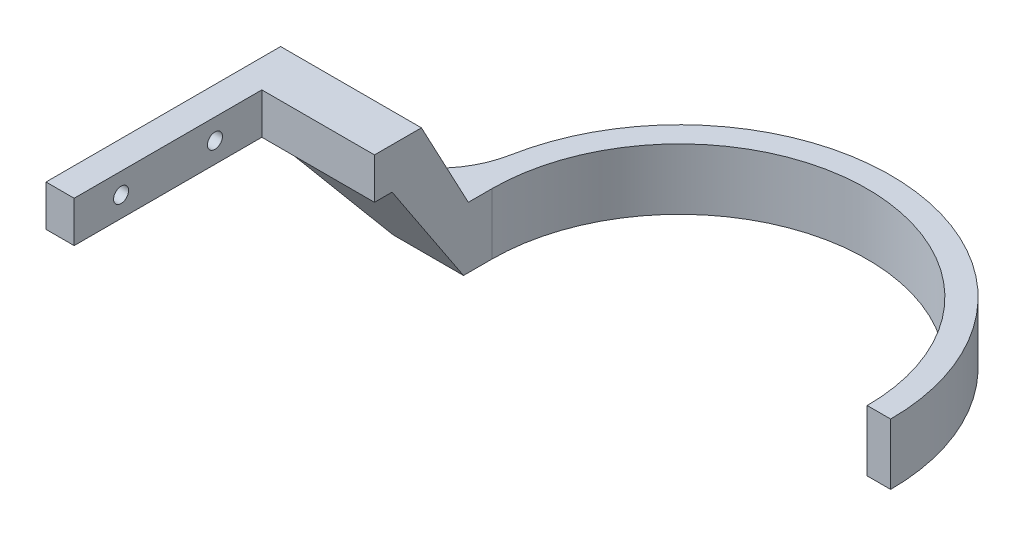
ISO-10303-21;
HEADER;
FILE_DESCRIPTION(('STEP AP214'),'2;1');
FILE_NAME('part.step','',(''),(''),'','','');
FILE_SCHEMA(('AUTOMOTIVE_DESIGN { 1 0 10303 214 1 1 1 1 }'));
ENDSEC;
DATA;
#1=APPLICATION_CONTEXT('core data for automotive mechanical design processes');
#2=APPLICATION_PROTOCOL_DEFINITION('international standard','automotive_design',2000,#1);
#3=PRODUCT_CONTEXT('',#1,'mechanical');
#4=PRODUCT('Part','Part','',(#3));
#5=PRODUCT_RELATED_PRODUCT_CATEGORY('part','',(#4));
#6=PRODUCT_DEFINITION_FORMATION('','',#4);
#7=PRODUCT_DEFINITION_CONTEXT('part definition',#1,'design');
#8=PRODUCT_DEFINITION('design','',#6,#7);
#9=PRODUCT_DEFINITION_SHAPE('','',#8);
#10=(LENGTH_UNIT() NAMED_UNIT(*) SI_UNIT(.MILLI.,.METRE.));
#11=(NAMED_UNIT(*) PLANE_ANGLE_UNIT() SI_UNIT($,.RADIAN.));
#12=(NAMED_UNIT(*) SI_UNIT($,.STERADIAN.) SOLID_ANGLE_UNIT());
#13=UNCERTAINTY_MEASURE_WITH_UNIT(LENGTH_MEASURE(1.E-05),#10,'distance_accuracy_value','');
#14=(GEOMETRIC_REPRESENTATION_CONTEXT(3) GLOBAL_UNCERTAINTY_ASSIGNED_CONTEXT((#13)) GLOBAL_UNIT_ASSIGNED_CONTEXT((#10,
#11,#12)) REPRESENTATION_CONTEXT('',''));
#15=CARTESIAN_POINT('',(0.,0.,0.));
#16=DIRECTION('',(0.,0.,1.));
#17=DIRECTION('',(1.,0.,0.));
#18=AXIS2_PLACEMENT_3D('',#15,#16,#17);
#19=CARTESIAN_POINT('',(0.,0.,25.));
#20=DIRECTION('',(0.,0.,1.));
#21=DIRECTION('',(1.,0.,0.));
#22=AXIS2_PLACEMENT_3D('',#19,#20,#21);
#23=PLANE('',#22);
#24=DIRECTION('',(-1.,0.,0.));
#25=VECTOR('',#24,1.);
#26=CARTESIAN_POINT('',(-40.,31.75,25.));
#27=LINE('',#26,#25);
#28=CARTESIAN_POINT('',(-40.,31.75,25.));
#29=VERTEX_POINT('',#28);
#30=CARTESIAN_POINT('',(-64.,31.75,25.));
#31=VERTEX_POINT('',#30);
#32=EDGE_CURVE('E173',#29,#31,#27,.T.);
#33=ORIENTED_EDGE('',*,*,#32,.T.);
#34=DIRECTION('',(0.,-1.,0.));
#35=VECTOR('',#34,1.);
#36=CARTESIAN_POINT('',(-64.,31.75,25.));
#37=LINE('',#36,#35);
#38=CARTESIAN_POINT('',(-64.,23.,25.));
#39=VERTEX_POINT('',#38);
#40=EDGE_CURVE('E159',#31,#39,#37,.T.);
#41=ORIENTED_EDGE('',*,*,#40,.T.);
#42=DIRECTION('',(1.,0.,0.));
#43=VECTOR('',#42,1.);
#44=CARTESIAN_POINT('',(-70.,23.,25.));
#45=LINE('',#44,#43);
#46=CARTESIAN_POINT('',(-40.,23.,25.));
#47=VERTEX_POINT('',#46);
#48=EDGE_CURVE('E158',#39,#47,#45,.T.);
#49=ORIENTED_EDGE('',*,*,#48,.T.);
#50=DIRECTION('',(0.,1.,0.));
#51=VECTOR('',#50,1.);
#52=CARTESIAN_POINT('',(-40.,23.,25.));
#53=LINE('',#52,#51);
#54=EDGE_CURVE('E177',#47,#29,#53,.T.);
#55=ORIENTED_EDGE('',*,*,#54,.T.);
#56=EDGE_LOOP('',(#33,#41,#49,#55));
#57=FACE_BOUND('',#56,.T.);
#58=ADVANCED_FACE('F35',(#57),#23,.T.);
#59=CARTESIAN_POINT('',(0.,13.,0.));
#60=DIRECTION('',(0.,-1.,0.));
#61=DIRECTION('',(0.,0.,-1.));
#62=AXIS2_PLACEMENT_3D('',#59,#60,#61);
#63=CYLINDRICAL_SURFACE('',#62,40.);
#64=CARTESIAN_POINT('',(0.,0.,0.));
#65=DIRECTION('',(0.,-1.,0.));
#66=DIRECTION('',(0.,0.,-1.));
#67=AXIS2_PLACEMENT_3D('',#64,#65,#66);
#68=CIRCLE('',#67,40.);
#69=CARTESIAN_POINT('',(-40.,0.,0.));
#70=VERTEX_POINT('',#69);
#71=CARTESIAN_POINT('',(40.,0.,0.));
#72=VERTEX_POINT('',#71);
#73=EDGE_CURVE('E202',#70,#72,#68,.T.);
#74=ORIENTED_EDGE('',*,*,#73,.T.);
#75=DIRECTION('',(0.,-1.,0.));
#76=VECTOR('',#75,1.);
#77=CARTESIAN_POINT('',(40.,13.,0.));
#78=LINE('',#77,#76);
#79=CARTESIAN_POINT('',(40.,13.,0.));
#80=VERTEX_POINT('',#79);
#81=EDGE_CURVE('E222',#80,#72,#78,.T.);
#82=ORIENTED_EDGE('',*,*,#81,.F.);
#83=CARTESIAN_POINT('',(0.,13.,0.));
#84=DIRECTION('',(0.,-1.,0.));
#85=DIRECTION('',(0.,0.,-1.));
#86=AXIS2_PLACEMENT_3D('',#83,#84,#85);
#87=CIRCLE('',#86,40.);
#88=CARTESIAN_POINT('',(-40.,13.,0.));
#89=VERTEX_POINT('',#88);
#90=EDGE_CURVE('E203',#89,#80,#87,.T.);
#91=ORIENTED_EDGE('',*,*,#90,.F.);
#92=DIRECTION('',(0.,-1.,0.));
#93=VECTOR('',#92,1.);
#94=CARTESIAN_POINT('',(-40.,13.,0.));
#95=LINE('',#94,#93);
#96=EDGE_CURVE('E211',#89,#70,#95,.T.);
#97=ORIENTED_EDGE('',*,*,#96,.T.);
#98=EDGE_LOOP('',(#74,#82,#91,#97));
#99=FACE_BOUND('',#98,.T.);
#100=ADVANCED_FACE('F274',(#99),#63,.F.);
#101=CARTESIAN_POINT('',(40.,13.,0.));
#102=DIRECTION('',(0.,0.,-1.));
#103=DIRECTION('',(-1.,0.,0.));
#104=AXIS2_PLACEMENT_3D('',#101,#102,#103);
#105=PLANE('',#104);
#106=DIRECTION('',(1.,0.,0.));
#107=VECTOR('',#106,1.);
#108=CARTESIAN_POINT('',(40.,0.,0.));
#109=LINE('',#108,#107);
#110=CARTESIAN_POINT('',(45.,0.,0.));
#111=VERTEX_POINT('',#110);
#112=EDGE_CURVE('E214',#72,#111,#109,.T.);
#113=ORIENTED_EDGE('',*,*,#112,.T.);
#114=DIRECTION('',(0.,-1.,0.));
#115=VECTOR('',#114,1.);
#116=CARTESIAN_POINT('',(45.,13.,0.));
#117=LINE('',#116,#115);
#118=CARTESIAN_POINT('',(45.,13.,0.));
#119=VERTEX_POINT('',#118);
#120=EDGE_CURVE('E219',#119,#111,#117,.T.);
#121=ORIENTED_EDGE('',*,*,#120,.F.);
#122=DIRECTION('',(1.,0.,0.));
#123=VECTOR('',#122,1.);
#124=CARTESIAN_POINT('',(40.,13.,0.));
#125=LINE('',#124,#123);
#126=EDGE_CURVE('E206',#80,#119,#125,.T.);
#127=ORIENTED_EDGE('',*,*,#126,.F.);
#128=ORIENTED_EDGE('',*,*,#81,.T.);
#129=EDGE_LOOP('',(#113,#121,#127,#128));
#130=FACE_BOUND('',#129,.T.);
#131=ADVANCED_FACE('F276',(#130),#105,.F.);
#132=CARTESIAN_POINT('',(0.,13.,0.));
#133=DIRECTION('',(0.,-1.,0.));
#134=DIRECTION('',(0.,0.,-1.));
#135=AXIS2_PLACEMENT_3D('',#132,#133,#134);
#136=CYLINDRICAL_SURFACE('',#135,45.);
#137=CARTESIAN_POINT('',(0.,0.,0.));
#138=DIRECTION('',(0.,1.,0.));
#139=DIRECTION('',(0.,0.,-1.));
#140=AXIS2_PLACEMENT_3D('',#137,#138,#139);
#141=CIRCLE('',#140,45.);
#142=CARTESIAN_POINT('',(-44.2273401531267,0.,-8.30315500154174));
#143=VERTEX_POINT('',#142);
#144=EDGE_CURVE('E207',#111,#143,#141,.T.);
#145=ORIENTED_EDGE('',*,*,#144,.T.);
#146=DIRECTION('',(0.,-1.,0.));
#147=VECTOR('',#146,1.);
#148=CARTESIAN_POINT('',(-44.2273401531267,13.,-8.30315500154174));
#149=LINE('',#148,#147);
#150=CARTESIAN_POINT('',(-44.2273401531267,13.,-8.30315500154174));
#151=VERTEX_POINT('',#150);
#152=EDGE_CURVE('E57',#143,#151,#149,.F.);
#153=ORIENTED_EDGE('',*,*,#152,.T.);
#154=CARTESIAN_POINT('',(0.,13.,0.));
#155=DIRECTION('',(0.,1.,0.));
#156=DIRECTION('',(0.,0.,-1.));
#157=AXIS2_PLACEMENT_3D('',#154,#155,#156);
#158=CIRCLE('',#157,45.);
#159=EDGE_CURVE('E209',#119,#151,#158,.T.);
#160=ORIENTED_EDGE('',*,*,#159,.F.);
#161=ORIENTED_EDGE('',*,*,#120,.T.);
#162=EDGE_LOOP('',(#145,#153,#160,#161));
#163=FACE_BOUND('',#162,.T.);
#164=ADVANCED_FACE('F278',(#163),#136,.T.);
#165=CARTESIAN_POINT('',(0.,13.,0.));
#166=DIRECTION('',(0.,-1.,0.));
#167=DIRECTION('',(0.,0.,-1.));
#168=AXIS2_PLACEMENT_3D('',#165,#166,#167);
#169=PLANE('',#168);
#170=ORIENTED_EDGE('',*,*,#159,.T.);
#171=CARTESIAN_POINT('',(-63.8839357767386,13.,-11.9934461133381));
#172=DIRECTION('',(0.,-1.,0.));
#173=DIRECTION('',(0.,0.,-1.));
#174=AXIS2_PLACEMENT_3D('',#171,#172,#173);
#175=CIRCLE('',#174,20.);
#176=CARTESIAN_POINT('',(-53.3377142167164,13.,5.));
#177=VERTEX_POINT('',#176);
#178=EDGE_CURVE('E43',#151,#177,#175,.T.);
#179=ORIENTED_EDGE('',*,*,#178,.T.);
#180=DIRECTION('',(-1.,0.,0.));
#181=VECTOR('',#180,1.);
#182=CARTESIAN_POINT('',(-40.,13.,5.));
#183=LINE('',#182,#181);
#184=CARTESIAN_POINT('',(-40.,13.,5.));
#185=VERTEX_POINT('',#184);
#186=EDGE_CURVE('E49',#185,#177,#183,.T.);
#187=ORIENTED_EDGE('',*,*,#186,.F.);
#188=DIRECTION('',(0.,0.,-1.));
#189=VECTOR('',#188,1.);
#190=CARTESIAN_POINT('',(-40.,13.,5.));
#191=LINE('',#190,#189);
#192=EDGE_CURVE('E199',#185,#89,#191,.T.);
#193=ORIENTED_EDGE('',*,*,#192,.T.);
#194=ORIENTED_EDGE('',*,*,#90,.T.);
#195=ORIENTED_EDGE('',*,*,#126,.T.);
#196=EDGE_LOOP('',(#170,#179,#187,#193,#194,#195));
#197=FACE_BOUND('',#196,.T.);
#198=ADVANCED_FACE('F250',(#197),#169,.F.);
#199=CARTESIAN_POINT('',(0.,0.,0.));
#200=DIRECTION('',(0.,-1.,0.));
#201=DIRECTION('',(0.,0.,-1.));
#202=AXIS2_PLACEMENT_3D('',#199,#200,#201);
#203=PLANE('',#202);
#204=DIRECTION('',(0.857492925712544,0.,-0.514495755427526));
#205=VECTOR('',#204,1.);
#206=CARTESIAN_POINT('',(-45.,0.,0.));
#207=LINE('',#206,#205);
#208=CARTESIAN_POINT('',(-55.0409152981843,0.,6.02454917891061));
#209=VERTEX_POINT('',#208);
#210=CARTESIAN_POINT('',(-53.594020668188,0.,5.15641240091282));
#211=VERTEX_POINT('',#210);
#212=EDGE_CURVE('E167',#209,#211,#207,.T.);
#213=ORIENTED_EDGE('',*,*,#212,.T.);
#214=CARTESIAN_POINT('',(-63.8839357767386,0.,-11.9934461133381));
#215=DIRECTION('',(0.,-1.,0.));
#216=DIRECTION('',(0.,0.,-1.));
#217=AXIS2_PLACEMENT_3D('',#214,#215,#216);
#218=CIRCLE('',#217,20.);
#219=EDGE_CURVE('E246',#211,#143,#218,.F.);
#220=ORIENTED_EDGE('',*,*,#219,.T.);
#221=ORIENTED_EDGE('',*,*,#144,.F.);
#222=ORIENTED_EDGE('',*,*,#112,.F.);
#223=ORIENTED_EDGE('',*,*,#73,.F.);
#224=DIRECTION('',(0.,0.,-1.));
#225=VECTOR('',#224,1.);
#226=CARTESIAN_POINT('',(-40.,0.,5.));
#227=LINE('',#226,#225);
#228=CARTESIAN_POINT('',(-40.,0.,6.02454917891061));
#229=VERTEX_POINT('',#228);
#230=EDGE_CURVE('E196',#229,#70,#227,.T.);
#231=ORIENTED_EDGE('',*,*,#230,.F.);
#232=DIRECTION('',(-1.,0.,0.));
#233=VECTOR('',#232,1.);
#234=CARTESIAN_POINT('',(-70.,0.,6.02454917891061));
#235=LINE('',#234,#233);
#236=EDGE_CURVE('E234',#229,#209,#235,.T.);
#237=ORIENTED_EDGE('',*,*,#236,.T.);
#238=EDGE_LOOP('',(#213,#220,#221,#222,#223,#231,#237));
#239=FACE_BOUND('',#238,.T.);
#240=ADVANCED_FACE('F285',(#239),#203,.T.);
#241=CARTESIAN_POINT('',(-40.,13.,5.));
#242=DIRECTION('',(-1.,0.,0.));
#243=DIRECTION('',(0.,0.,1.));
#244=AXIS2_PLACEMENT_3D('',#241,#242,#243);
#245=PLANE('',#244);
#246=ORIENTED_EDGE('',*,*,#96,.F.);
#247=ORIENTED_EDGE('',*,*,#192,.F.);
#248=DIRECTION('',(0.,0.882352941176471,0.470588235294118));
#249=VECTOR('',#248,1.);
#250=CARTESIAN_POINT('',(-40.,13.,5.));
#251=LINE('',#250,#249);
#252=CARTESIAN_POINT('',(-40.,31.75,15.));
#253=VERTEX_POINT('',#252);
#254=EDGE_CURVE('E189',#185,#253,#251,.T.);
#255=ORIENTED_EDGE('',*,*,#254,.T.);
#256=DIRECTION('',(0.,0.,-1.));
#257=VECTOR('',#256,1.);
#258=CARTESIAN_POINT('',(-40.,31.75,25.));
#259=LINE('',#258,#257);
#260=EDGE_CURVE('E179',#29,#253,#259,.T.);
#261=ORIENTED_EDGE('',*,*,#260,.F.);
#262=ORIENTED_EDGE('',*,*,#54,.F.);
#263=DIRECTION('',(0.,0.,-1.));
#264=VECTOR('',#263,1.);
#265=CARTESIAN_POINT('',(-40.,23.,25.));
#266=LINE('',#265,#264);
#267=CARTESIAN_POINT('',(-40.,23.,21.2470890830353));
#268=VERTEX_POINT('',#267);
#269=EDGE_CURVE('E181',#47,#268,#266,.T.);
#270=ORIENTED_EDGE('',*,*,#269,.T.);
#271=DIRECTION('',(0.,-0.833899638818183,-0.551916109910649));
#272=VECTOR('',#271,1.);
#273=CARTESIAN_POINT('',(-40.,8.56851067533449,11.6956142082235));
#274=LINE('',#273,#272);
#275=EDGE_CURVE('E231',#268,#229,#274,.T.);
#276=ORIENTED_EDGE('',*,*,#275,.T.);
#277=ORIENTED_EDGE('',*,*,#230,.T.);
#278=EDGE_LOOP('',(#246,#247,#255,#261,#262,#270,#276,#277));
#279=FACE_BOUND('',#278,.T.);
#280=ADVANCED_FACE('F269',(#279),#245,.F.);
#281=CARTESIAN_POINT('',(-70.,13.,5.));
#282=DIRECTION('',(1.,0.,0.));
#283=DIRECTION('',(0.,0.,-1.));
#284=AXIS2_PLACEMENT_3D('',#281,#282,#283);
#285=PLANE('',#284);
#286=CARTESIAN_POINT('',(-70.,27.375,55.));
#287=DIRECTION('',(1.,0.,0.));
#288=DIRECTION('',(0.,0.,-1.));
#289=AXIS2_PLACEMENT_3D('',#286,#287,#288);
#290=CIRCLE('',#289,1.6);
#291=CARTESIAN_POINT('',(-70.,27.375,53.4));
#292=VERTEX_POINT('',#291);
#293=EDGE_CURVE('E473',#292,#292,#290,.T.);
#294=ORIENTED_EDGE('',*,*,#293,.T.);
#295=EDGE_LOOP('',(#294));
#296=FACE_BOUND('',#295,.T.);
#297=CARTESIAN_POINT('',(-70.,27.375,35.));
#298=DIRECTION('',(1.,0.,0.));
#299=DIRECTION('',(0.,0.,-1.));
#300=AXIS2_PLACEMENT_3D('',#297,#298,#299);
#301=CIRCLE('',#300,1.6);
#302=CARTESIAN_POINT('',(-70.,27.375,33.4));
#303=VERTEX_POINT('',#302);
#304=EDGE_CURVE('E166',#303,#303,#301,.T.);
#305=ORIENTED_EDGE('',*,*,#304,.T.);
#306=EDGE_LOOP('',(#305));
#307=FACE_BOUND('',#306,.T.);
#308=DIRECTION('',(0.,0.,-1.));
#309=VECTOR('',#308,1.);
#310=CARTESIAN_POINT('',(-70.,31.75,25.));
#311=LINE('',#310,#309);
#312=CARTESIAN_POINT('',(-70.,31.75,65.));
#313=VERTEX_POINT('',#312);
#314=CARTESIAN_POINT('',(-70.,31.75,15.));
#315=VERTEX_POINT('',#314);
#316=EDGE_CURVE('E186',#313,#315,#311,.T.);
#317=ORIENTED_EDGE('',*,*,#316,.T.);
#318=DIRECTION('',(0.,1.,0.));
#319=VECTOR('',#318,1.);
#320=CARTESIAN_POINT('',(-70.,0.,15.));
#321=LINE('',#320,#319);
#322=CARTESIAN_POINT('',(-70.,13.5611645747186,15.));
#323=VERTEX_POINT('',#322);
#324=EDGE_CURVE('E171',#323,#315,#321,.T.);
#325=ORIENTED_EDGE('',*,*,#324,.F.);
#326=DIRECTION('',(0.,0.833899638818183,0.551916109910649));
#327=VECTOR('',#326,1.);
#328=CARTESIAN_POINT('',(-70.,8.56851067533449,11.6956142082235));
#329=LINE('',#328,#327);
#330=CARTESIAN_POINT('',(-70.,23.,21.2470890830353));
#331=VERTEX_POINT('',#330);
#332=EDGE_CURVE('E240',#323,#331,#329,.T.);
#333=ORIENTED_EDGE('',*,*,#332,.T.);
#334=DIRECTION('',(0.,0.,-1.));
#335=VECTOR('',#334,1.);
#336=CARTESIAN_POINT('',(-70.,23.,25.));
#337=LINE('',#336,#335);
#338=CARTESIAN_POINT('',(-70.,23.,65.));
#339=VERTEX_POINT('',#338);
#340=EDGE_CURVE('E184',#339,#331,#337,.T.);
#341=ORIENTED_EDGE('',*,*,#340,.F.);
#342=DIRECTION('',(0.,1.,0.));
#343=VECTOR('',#342,1.);
#344=CARTESIAN_POINT('',(-70.,31.75,65.));
#345=LINE('',#344,#343);
#346=EDGE_CURVE('E142',#339,#313,#345,.T.);
#347=ORIENTED_EDGE('',*,*,#346,.T.);
#348=EDGE_LOOP('',(#317,#325,#333,#341,#347));
#349=FACE_BOUND('',#348,.T.);
#350=ADVANCED_FACE('F261',(#296,#307,#349),#285,.F.);
#351=CARTESIAN_POINT('',(-103.28757275621,13.,5.));
#352=DIRECTION('',(0.,0.470588235294118,-0.882352941176471));
#353=DIRECTION('',(0.,0.882352941176471,0.470588235294118));
#354=AXIS2_PLACEMENT_3D('',#351,#352,#353);
#355=PLANE('',#354);
#356=DIRECTION('',(0.617139935181102,-0.694282427078739,-0.370283961108661));
#357=VECTOR('',#356,1.);
#358=CARTESIAN_POINT('',(-72.3589898619226,34.4038635946629,16.4153939171535));
#359=LINE('',#358,#357);
#360=CARTESIAN_POINT('',(-53.594020668188,13.2932732517115,5.15641240091281));
#361=VERTEX_POINT('',#360);
#362=EDGE_CURVE('E225',#315,#361,#359,.T.);
#363=ORIENTED_EDGE('',*,*,#362,.F.);
#364=DIRECTION('',(1.,0.,0.));
#365=VECTOR('',#364,1.);
#366=CARTESIAN_POINT('',(-103.28757275621,31.75,15.));
#367=LINE('',#366,#365);
#368=EDGE_CURVE('E192',#315,#253,#367,.T.);
#369=ORIENTED_EDGE('',*,*,#368,.T.);
#370=ORIENTED_EDGE('',*,*,#254,.F.);
#371=ORIENTED_EDGE('',*,*,#186,.T.);
#372=CARTESIAN_POINT('',(-63.8839357767386,-18.8627114625089,-11.9934461133381));
#373=DIRECTION('',(0.,0.470588235294118,-0.882352941176471));
#374=DIRECTION('',(0.,-0.882352941176471,-0.470588235294118));
#375=AXIS2_PLACEMENT_3D('',#372,#373,#374);
#376=ELLIPSE('',#375,42.5,20.);
#377=EDGE_CURVE('E11',#177,#361,#376,.F.);
#378=ORIENTED_EDGE('',*,*,#377,.T.);
#379=EDGE_LOOP('',(#363,#369,#370,#371,#378));
#380=FACE_BOUND('',#379,.T.);
#381=ADVANCED_FACE('F255',(#380),#355,.T.);
#382=CARTESIAN_POINT('',(-40.,31.75,25.));
#383=DIRECTION('',(0.,-1.,0.));
#384=DIRECTION('',(0.,0.,-1.));
#385=AXIS2_PLACEMENT_3D('',#382,#383,#384);
#386=PLANE('',#385);
#387=ORIENTED_EDGE('',*,*,#368,.F.);
#388=ORIENTED_EDGE('',*,*,#316,.F.);
#389=DIRECTION('',(-1.,0.,0.));
#390=VECTOR('',#389,1.);
#391=CARTESIAN_POINT('',(-64.,31.75,65.));
#392=LINE('',#391,#390);
#393=CARTESIAN_POINT('',(-64.,31.75,65.));
#394=VERTEX_POINT('',#393);
#395=EDGE_CURVE('E146',#394,#313,#392,.T.);
#396=ORIENTED_EDGE('',*,*,#395,.F.);
#397=DIRECTION('',(0.,0.,-1.));
#398=VECTOR('',#397,1.);
#399=CARTESIAN_POINT('',(-64.,31.75,25.));
#400=LINE('',#399,#398);
#401=EDGE_CURVE('E147',#394,#31,#400,.T.);
#402=ORIENTED_EDGE('',*,*,#401,.T.);
#403=ORIENTED_EDGE('',*,*,#32,.F.);
#404=ORIENTED_EDGE('',*,*,#260,.T.);
#405=EDGE_LOOP('',(#387,#388,#396,#402,#403,#404));
#406=FACE_BOUND('',#405,.T.);
#407=ADVANCED_FACE('F264',(#406),#386,.F.);
#408=CARTESIAN_POINT('',(-70.,23.,25.));
#409=DIRECTION('',(0.,1.,0.));
#410=DIRECTION('',(0.,0.,1.));
#411=AXIS2_PLACEMENT_3D('',#408,#409,#410);
#412=PLANE('',#411);
#413=ORIENTED_EDGE('',*,*,#340,.T.);
#414=DIRECTION('',(1.,0.,0.));
#415=VECTOR('',#414,1.);
#416=CARTESIAN_POINT('',(-70.,23.,21.2470890830353));
#417=LINE('',#416,#415);
#418=EDGE_CURVE('E228',#331,#268,#417,.T.);
#419=ORIENTED_EDGE('',*,*,#418,.T.);
#420=ORIENTED_EDGE('',*,*,#269,.F.);
#421=ORIENTED_EDGE('',*,*,#48,.F.);
#422=DIRECTION('',(0.,0.,1.));
#423=VECTOR('',#422,1.);
#424=CARTESIAN_POINT('',(-64.,23.,25.));
#425=LINE('',#424,#423);
#426=CARTESIAN_POINT('',(-64.,23.,65.));
#427=VERTEX_POINT('',#426);
#428=EDGE_CURVE('E151',#39,#427,#425,.T.);
#429=ORIENTED_EDGE('',*,*,#428,.T.);
#430=DIRECTION('',(-1.,0.,0.));
#431=VECTOR('',#430,1.);
#432=CARTESIAN_POINT('',(-64.,23.,65.));
#433=LINE('',#432,#431);
#434=EDGE_CURVE('E135',#427,#339,#433,.T.);
#435=ORIENTED_EDGE('',*,*,#434,.T.);
#436=EDGE_LOOP('',(#413,#419,#420,#421,#429,#435));
#437=FACE_BOUND('',#436,.T.);
#438=ADVANCED_FACE('F156',(#437),#412,.F.);
#439=CARTESIAN_POINT('',(-45.,0.,0.));
#440=DIRECTION('',(0.514495755427526,0.,0.857492925712544));
#441=DIRECTION('',(0.857492925712544,0.,-0.514495755427526));
#442=AXIS2_PLACEMENT_3D('',#439,#440,#441);
#443=PLANE('',#442);
#444=ORIENTED_EDGE('',*,*,#362,.T.);
#445=DIRECTION('',(0.,1.,0.));
#446=VECTOR('',#445,1.);
#447=CARTESIAN_POINT('',(-53.594020668188,0.,5.15641240091282));
#448=LINE('',#447,#446);
#449=EDGE_CURVE('E242',#361,#211,#448,.F.);
#450=ORIENTED_EDGE('',*,*,#449,.T.);
#451=ORIENTED_EDGE('',*,*,#212,.F.);
#452=DIRECTION('',(-0.677000797348314,0.613735359686939,0.406200478408988));
#453=VECTOR('',#452,1.);
#454=CARTESIAN_POINT('',(-48.7821225273361,-5.67391123831461,2.26927351640167));
#455=LINE('',#454,#453);
#456=EDGE_CURVE('E237',#209,#323,#455,.T.);
#457=ORIENTED_EDGE('',*,*,#456,.T.);
#458=ORIENTED_EDGE('',*,*,#324,.T.);
#459=EDGE_LOOP('',(#444,#450,#451,#457,#458));
#460=FACE_BOUND('',#459,.T.);
#461=ADVANCED_FACE('F257',(#460),#443,.F.);
#462=CARTESIAN_POINT('',(-64.,31.75,65.));
#463=DIRECTION('',(0.,0.,1.));
#464=DIRECTION('',(0.,-1.,0.));
#465=AXIS2_PLACEMENT_3D('',#462,#463,#464);
#466=PLANE('',#465);
#467=ORIENTED_EDGE('',*,*,#346,.F.);
#468=ORIENTED_EDGE('',*,*,#434,.F.);
#469=DIRECTION('',(0.,1.,0.));
#470=VECTOR('',#469,1.);
#471=CARTESIAN_POINT('',(-64.,31.75,65.));
#472=LINE('',#471,#470);
#473=EDGE_CURVE('E139',#427,#394,#472,.T.);
#474=ORIENTED_EDGE('',*,*,#473,.T.);
#475=ORIENTED_EDGE('',*,*,#395,.T.);
#476=EDGE_LOOP('',(#467,#468,#474,#475));
#477=FACE_BOUND('',#476,.T.);
#478=ADVANCED_FACE('F137',(#477),#466,.T.);
#479=CARTESIAN_POINT('',(-64.,0.,0.));
#480=DIRECTION('',(-1.,0.,0.));
#481=DIRECTION('',(0.,0.,1.));
#482=AXIS2_PLACEMENT_3D('',#479,#480,#481);
#483=PLANE('',#482);
#484=CARTESIAN_POINT('',(-64.,27.375,55.));
#485=DIRECTION('',(1.,0.,0.));
#486=DIRECTION('',(0.,0.,-1.));
#487=AXIS2_PLACEMENT_3D('',#484,#485,#486);
#488=CIRCLE('',#487,1.6);
#489=CARTESIAN_POINT('',(-64.,27.375,53.4));
#490=VERTEX_POINT('',#489);
#491=EDGE_CURVE('E466',#490,#490,#488,.T.);
#492=ORIENTED_EDGE('',*,*,#491,.F.);
#493=EDGE_LOOP('',(#492));
#494=FACE_BOUND('',#493,.T.);
#495=CARTESIAN_POINT('',(-64.,27.375,35.));
#496=DIRECTION('',(1.,0.,0.));
#497=DIRECTION('',(0.,0.,-1.));
#498=AXIS2_PLACEMENT_3D('',#495,#496,#497);
#499=CIRCLE('',#498,1.6);
#500=CARTESIAN_POINT('',(-64.,27.375,33.4));
#501=VERTEX_POINT('',#500);
#502=EDGE_CURVE('E469',#501,#501,#499,.T.);
#503=ORIENTED_EDGE('',*,*,#502,.F.);
#504=EDGE_LOOP('',(#503));
#505=FACE_BOUND('',#504,.T.);
#506=ORIENTED_EDGE('',*,*,#40,.F.);
#507=ORIENTED_EDGE('',*,*,#401,.F.);
#508=ORIENTED_EDGE('',*,*,#473,.F.);
#509=ORIENTED_EDGE('',*,*,#428,.F.);
#510=EDGE_LOOP('',(#506,#507,#508,#509));
#511=FACE_BOUND('',#510,.T.);
#512=ADVANCED_FACE('F150',(#494,#505,#511),#483,.F.);
#513=CARTESIAN_POINT('',(-70.,27.375,35.));
#514=DIRECTION('',(1.,0.,0.));
#515=DIRECTION('',(0.,0.,-1.));
#516=AXIS2_PLACEMENT_3D('',#513,#514,#515);
#517=CYLINDRICAL_SURFACE('',#516,1.6);
#518=ORIENTED_EDGE('',*,*,#304,.F.);
#519=EDGE_LOOP('',(#518));
#520=FACE_BOUND('',#519,.T.);
#521=ORIENTED_EDGE('',*,*,#502,.T.);
#522=EDGE_LOOP('',(#521));
#523=FACE_BOUND('',#522,.T.);
#524=ADVANCED_FACE('F323',(#520,#523),#517,.F.);
#525=CARTESIAN_POINT('',(-70.,27.375,55.));
#526=DIRECTION('',(1.,0.,0.));
#527=DIRECTION('',(0.,0.,-1.));
#528=AXIS2_PLACEMENT_3D('',#525,#526,#527);
#529=CYLINDRICAL_SURFACE('',#528,1.6);
#530=ORIENTED_EDGE('',*,*,#293,.F.);
#531=EDGE_LOOP('',(#530));
#532=FACE_BOUND('',#531,.T.);
#533=ORIENTED_EDGE('',*,*,#491,.T.);
#534=EDGE_LOOP('',(#533));
#535=FACE_BOUND('',#534,.T.);
#536=ADVANCED_FACE('F318',(#532,#535),#529,.F.);
#537=CARTESIAN_POINT('',(-70.,23.,21.2470890830353));
#538=DIRECTION('',(0.,0.551916109910649,-0.833899638818183));
#539=DIRECTION('',(1.,0.,0.));
#540=AXIS2_PLACEMENT_3D('',#537,#538,#539);
#541=PLANE('',#540);
#542=ORIENTED_EDGE('',*,*,#456,.F.);
#543=ORIENTED_EDGE('',*,*,#236,.F.);
#544=ORIENTED_EDGE('',*,*,#275,.F.);
#545=ORIENTED_EDGE('',*,*,#418,.F.);
#546=ORIENTED_EDGE('',*,*,#332,.F.);
#547=EDGE_LOOP('',(#542,#543,#544,#545,#546));
#548=FACE_BOUND('',#547,.T.);
#549=ADVANCED_FACE('F315',(#548),#541,.F.);
#550=CARTESIAN_POINT('',(-63.8839357767386,13.,-11.9934461133381));
#551=DIRECTION('',(0.,-1.,0.));
#552=DIRECTION('',(0.,0.,-1.));
#553=AXIS2_PLACEMENT_3D('',#550,#551,#552);
#554=CYLINDRICAL_SURFACE('',#553,20.);
#555=ORIENTED_EDGE('',*,*,#178,.F.);
#556=ORIENTED_EDGE('',*,*,#152,.F.);
#557=ORIENTED_EDGE('',*,*,#219,.F.);
#558=ORIENTED_EDGE('',*,*,#449,.F.);
#559=ORIENTED_EDGE('',*,*,#377,.F.);
#560=EDGE_LOOP('',(#555,#556,#557,#558,#559));
#561=FACE_BOUND('',#560,.T.);
#562=ADVANCED_FACE('F37',(#561),#554,.F.);
#563=CLOSED_SHELL('',(#58,#100,#131,#164,#198,#240,#280,#350,#381,#407,#438,#461,#478,#512,#524,
#536,#549,#562));
#564=MANIFOLD_SOLID_BREP('B2',#563);
#565=ADVANCED_BREP_SHAPE_REPRESENTATION('',(#18,#564),#14);
#566=SHAPE_DEFINITION_REPRESENTATION(#9,#565);
ENDSEC;
END-ISO-10303-21;
